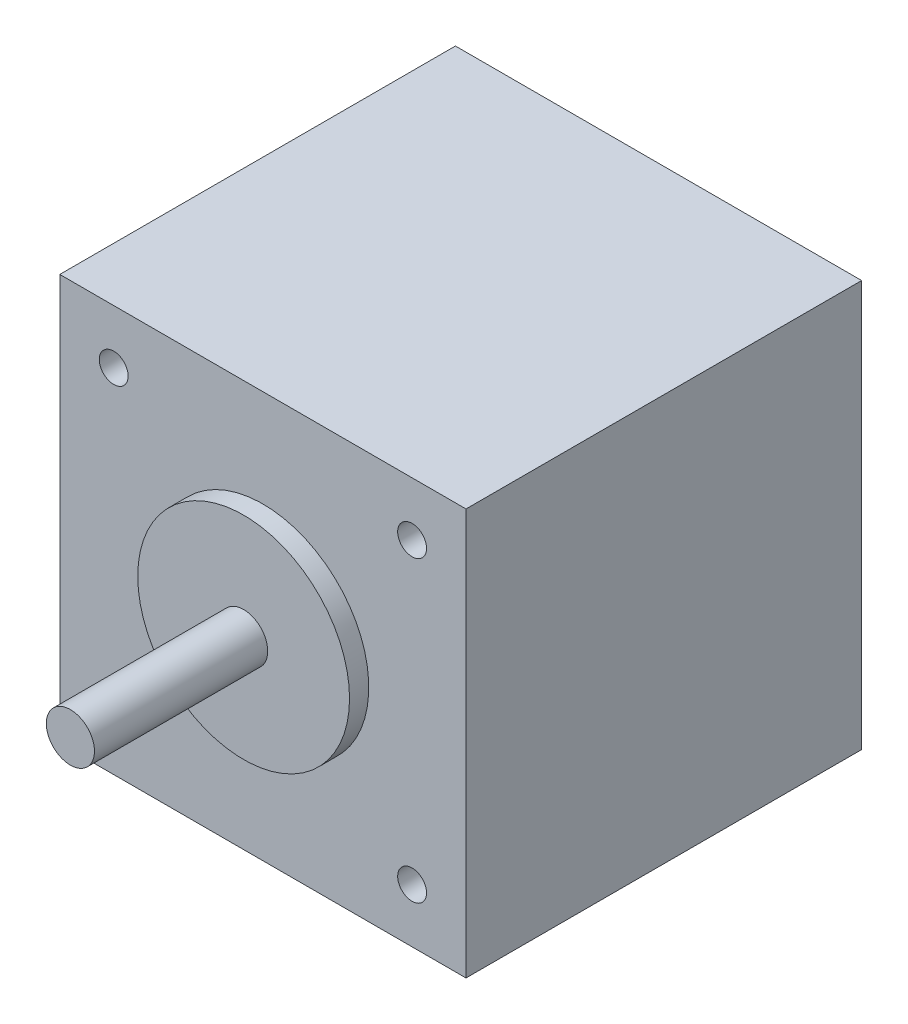
ISO-10303-21;
HEADER;
FILE_DESCRIPTION(('STEP AP214'),'2;1');
FILE_NAME('part.step','',(''),(''),'','','');
FILE_SCHEMA(('AUTOMOTIVE_DESIGN { 1 0 10303 214 1 1 1 1 }'));
ENDSEC;
DATA;
#1=APPLICATION_CONTEXT('core data for automotive mechanical design processes');
#2=APPLICATION_PROTOCOL_DEFINITION('international standard','automotive_design',2000,#1);
#3=PRODUCT_CONTEXT('',#1,'mechanical');
#4=PRODUCT('Part','Part','',(#3));
#5=PRODUCT_RELATED_PRODUCT_CATEGORY('part','',(#4));
#6=PRODUCT_DEFINITION_FORMATION('','',#4);
#7=PRODUCT_DEFINITION_CONTEXT('part definition',#1,'design');
#8=PRODUCT_DEFINITION('design','',#6,#7);
#9=PRODUCT_DEFINITION_SHAPE('','',#8);
#10=(LENGTH_UNIT() NAMED_UNIT(*) SI_UNIT(.MILLI.,.METRE.));
#11=(NAMED_UNIT(*) PLANE_ANGLE_UNIT() SI_UNIT($,.RADIAN.));
#12=(NAMED_UNIT(*) SI_UNIT($,.STERADIAN.) SOLID_ANGLE_UNIT());
#13=UNCERTAINTY_MEASURE_WITH_UNIT(LENGTH_MEASURE(1.E-05),#10,'distance_accuracy_value','');
#14=(GEOMETRIC_REPRESENTATION_CONTEXT(3) GLOBAL_UNCERTAINTY_ASSIGNED_CONTEXT((#13)) GLOBAL_UNIT_ASSIGNED_CONTEXT((#10,
#11,#12)) REPRESENTATION_CONTEXT('',''));
#15=CARTESIAN_POINT('',(0.,0.,0.));
#16=DIRECTION('',(0.,0.,1.));
#17=DIRECTION('',(1.,0.,0.));
#18=AXIS2_PLACEMENT_3D('',#15,#16,#17);
#19=CARTESIAN_POINT('',(7.02359479370018,4.42273020296525,43.1));
#20=DIRECTION('',(0.,0.,1.));
#21=DIRECTION('',(1.,0.,0.));
#22=AXIS2_PLACEMENT_3D('',#19,#20,#21);
#23=PLANE('',#22);
#24=CARTESIAN_POINT('',(7.02359479370018,4.42273020296525,43.1));
#25=DIRECTION('',(0.,0.,1.));
#26=DIRECTION('',(1.,0.,0.));
#27=AXIS2_PLACEMENT_3D('',#24,#25,#26);
#28=CIRCLE('',#27,11.);
#29=CARTESIAN_POINT('',(18.0235947937002,4.42273020296525,43.1));
#30=VERTEX_POINT('',#29);
#31=EDGE_CURVE('E101',#30,#30,#28,.T.);
#32=ORIENTED_EDGE('',*,*,#31,.T.);
#33=EDGE_LOOP('',(#32));
#34=FACE_BOUND('',#33,.T.);
#35=CARTESIAN_POINT('',(7.02359479370018,4.42273020296525,43.1));
#36=DIRECTION('',(0.,0.,1.));
#37=DIRECTION('',(1.,0.,0.));
#38=AXIS2_PLACEMENT_3D('',#35,#36,#37);
#39=CIRCLE('',#38,2.5);
#40=CARTESIAN_POINT('',(9.52359479370018,4.42273020296525,43.1));
#41=VERTEX_POINT('',#40);
#42=EDGE_CURVE('E197',#41,#41,#39,.T.);
#43=ORIENTED_EDGE('',*,*,#42,.F.);
#44=EDGE_LOOP('',(#43));
#45=FACE_BOUND('',#44,.T.);
#46=ADVANCED_FACE('F30',(#34,#45),#23,.T.);
#47=CARTESIAN_POINT('',(28.1235947937002,-16.6772697970347,41.1));
#48=DIRECTION('',(0.,0.,-1.));
#49=DIRECTION('',(-1.,0.,0.));
#50=AXIS2_PLACEMENT_3D('',#47,#48,#49);
#51=PLANE('',#50);
#52=CARTESIAN_POINT('',(-8.47640520629982,-11.0772697970348,41.1));
#53=DIRECTION('',(0.,0.,1.));
#54=DIRECTION('',(-1.,0.,0.));
#55=AXIS2_PLACEMENT_3D('',#52,#53,#54);
#56=CIRCLE('',#55,1.5);
#57=CARTESIAN_POINT('',(-9.97640520629982,-11.0772697970348,41.1));
#58=VERTEX_POINT('',#57);
#59=EDGE_CURVE('E177',#58,#58,#56,.T.);
#60=ORIENTED_EDGE('',*,*,#59,.F.);
#61=EDGE_LOOP('',(#60));
#62=FACE_BOUND('',#61,.T.);
#63=CARTESIAN_POINT('',(22.5235947937002,-11.0772697970347,41.1));
#64=DIRECTION('',(0.,0.,1.));
#65=DIRECTION('',(1.,0.,0.));
#66=AXIS2_PLACEMENT_3D('',#63,#64,#65);
#67=CIRCLE('',#66,1.5);
#68=CARTESIAN_POINT('',(24.0235947937002,-11.0772697970347,41.1));
#69=VERTEX_POINT('',#68);
#70=EDGE_CURVE('E176',#69,#69,#67,.T.);
#71=ORIENTED_EDGE('',*,*,#70,.F.);
#72=EDGE_LOOP('',(#71));
#73=FACE_BOUND('',#72,.T.);
#74=CARTESIAN_POINT('',(22.5235947937002,19.9227302029653,41.1));
#75=DIRECTION('',(0.,0.,1.));
#76=DIRECTION('',(-1.,0.,0.));
#77=AXIS2_PLACEMENT_3D('',#74,#75,#76);
#78=CIRCLE('',#77,1.5);
#79=CARTESIAN_POINT('',(21.0235947937002,19.9227302029653,41.1));
#80=VERTEX_POINT('',#79);
#81=EDGE_CURVE('E186',#80,#80,#78,.T.);
#82=ORIENTED_EDGE('',*,*,#81,.F.);
#83=EDGE_LOOP('',(#82));
#84=FACE_BOUND('',#83,.T.);
#85=CARTESIAN_POINT('',(-8.47640520629982,19.9227302029652,41.1));
#86=DIRECTION('',(0.,0.,1.));
#87=DIRECTION('',(1.,0.,0.));
#88=AXIS2_PLACEMENT_3D('',#85,#86,#87);
#89=CIRCLE('',#88,1.5);
#90=CARTESIAN_POINT('',(-6.97640520629982,19.9227302029652,41.1));
#91=VERTEX_POINT('',#90);
#92=EDGE_CURVE('E191',#91,#91,#89,.T.);
#93=ORIENTED_EDGE('',*,*,#92,.F.);
#94=EDGE_LOOP('',(#93));
#95=FACE_BOUND('',#94,.T.);
#96=DIRECTION('',(0.,1.,0.));
#97=VECTOR('',#96,1.);
#98=CARTESIAN_POINT('',(28.1235947937002,25.5227302029652,41.1));
#99=LINE('',#98,#97);
#100=CARTESIAN_POINT('',(28.1235947937002,-16.6772697970347,41.1));
#101=VERTEX_POINT('',#100);
#102=CARTESIAN_POINT('',(28.1235947937002,25.5227302029652,41.1));
#103=VERTEX_POINT('',#102);
#104=EDGE_CURVE('E84',#101,#103,#99,.T.);
#105=ORIENTED_EDGE('',*,*,#104,.T.);
#106=DIRECTION('',(-1.,0.,0.));
#107=VECTOR('',#106,1.);
#108=CARTESIAN_POINT('',(28.1235947937002,25.5227302029652,41.1));
#109=LINE('',#108,#107);
#110=CARTESIAN_POINT('',(-14.0764052062998,25.5227302029652,41.1));
#111=VERTEX_POINT('',#110);
#112=EDGE_CURVE('E78',#103,#111,#109,.T.);
#113=ORIENTED_EDGE('',*,*,#112,.T.);
#114=DIRECTION('',(0.,-1.,0.));
#115=VECTOR('',#114,1.);
#116=CARTESIAN_POINT('',(-14.0764052062998,25.5227302029652,41.1));
#117=LINE('',#116,#115);
#118=CARTESIAN_POINT('',(-14.0764052062998,-16.6772697970348,41.1));
#119=VERTEX_POINT('',#118);
#120=EDGE_CURVE('E82',#111,#119,#117,.T.);
#121=ORIENTED_EDGE('',*,*,#120,.T.);
#122=DIRECTION('',(1.,0.,0.));
#123=VECTOR('',#122,1.);
#124=CARTESIAN_POINT('',(28.1235947937002,-16.6772697970347,41.1));
#125=LINE('',#124,#123);
#126=EDGE_CURVE('E47',#119,#101,#125,.T.);
#127=ORIENTED_EDGE('',*,*,#126,.T.);
#128=EDGE_LOOP('',(#105,#113,#121,#127));
#129=FACE_BOUND('',#128,.T.);
#130=CARTESIAN_POINT('',(7.02359479370018,4.42273020296525,41.1));
#131=DIRECTION('',(0.,0.,-1.));
#132=DIRECTION('',(-1.,0.,0.));
#133=AXIS2_PLACEMENT_3D('',#130,#131,#132);
#134=CIRCLE('',#133,11.);
#135=CARTESIAN_POINT('',(-3.97640520629982,4.42273020296525,41.1));
#136=VERTEX_POINT('',#135);
#137=EDGE_CURVE('E11',#136,#136,#134,.F.);
#138=ORIENTED_EDGE('',*,*,#137,.F.);
#139=EDGE_LOOP('',(#138));
#140=FACE_BOUND('',#139,.T.);
#141=ADVANCED_FACE('F79',(#62,#73,#84,#95,#129,#140),#51,.F.);
#142=CARTESIAN_POINT('',(28.1235947937002,25.5227302029652,41.1));
#143=DIRECTION('',(-1.,0.,0.));
#144=DIRECTION('',(0.,-1.,0.));
#145=AXIS2_PLACEMENT_3D('',#142,#143,#144);
#146=PLANE('',#145);
#147=DIRECTION('',(0.,1.,0.));
#148=VECTOR('',#147,1.);
#149=CARTESIAN_POINT('',(28.1235947937002,25.5227302029652,0.));
#150=LINE('',#149,#148);
#151=CARTESIAN_POINT('',(28.1235947937002,-16.6772697970347,0.));
#152=VERTEX_POINT('',#151);
#153=CARTESIAN_POINT('',(28.1235947937002,25.5227302029652,0.));
#154=VERTEX_POINT('',#153);
#155=EDGE_CURVE('E98',#152,#154,#150,.T.);
#156=ORIENTED_EDGE('',*,*,#155,.T.);
#157=DIRECTION('',(0.,0.,-1.));
#158=VECTOR('',#157,1.);
#159=CARTESIAN_POINT('',(28.1235947937002,25.5227302029652,41.1));
#160=LINE('',#159,#158);
#161=EDGE_CURVE('E39',#103,#154,#160,.T.);
#162=ORIENTED_EDGE('',*,*,#161,.F.);
#163=ORIENTED_EDGE('',*,*,#104,.F.);
#164=DIRECTION('',(0.,0.,-1.));
#165=VECTOR('',#164,1.);
#166=CARTESIAN_POINT('',(28.1235947937002,-16.6772697970347,41.1));
#167=LINE('',#166,#165);
#168=EDGE_CURVE('E94',#101,#152,#167,.T.);
#169=ORIENTED_EDGE('',*,*,#168,.T.);
#170=EDGE_LOOP('',(#156,#162,#163,#169));
#171=FACE_BOUND('',#170,.T.);
#172=ADVANCED_FACE('F32',(#171),#146,.F.);
#173=CARTESIAN_POINT('',(28.1235947937002,25.5227302029652,41.1));
#174=DIRECTION('',(0.,-1.,0.));
#175=DIRECTION('',(0.,0.,-1.));
#176=AXIS2_PLACEMENT_3D('',#173,#174,#175);
#177=PLANE('',#176);
#178=DIRECTION('',(-1.,0.,0.));
#179=VECTOR('',#178,1.);
#180=CARTESIAN_POINT('',(28.1235947937002,25.5227302029652,0.));
#181=LINE('',#180,#179);
#182=CARTESIAN_POINT('',(-14.0764052062998,25.5227302029652,0.));
#183=VERTEX_POINT('',#182);
#184=EDGE_CURVE('E89',#154,#183,#181,.T.);
#185=ORIENTED_EDGE('',*,*,#184,.T.);
#186=DIRECTION('',(0.,0.,-1.));
#187=VECTOR('',#186,1.);
#188=CARTESIAN_POINT('',(-14.0764052062998,25.5227302029652,41.1));
#189=LINE('',#188,#187);
#190=EDGE_CURVE('E87',#111,#183,#189,.T.);
#191=ORIENTED_EDGE('',*,*,#190,.F.);
#192=ORIENTED_EDGE('',*,*,#112,.F.);
#193=ORIENTED_EDGE('',*,*,#161,.T.);
#194=EDGE_LOOP('',(#185,#191,#192,#193));
#195=FACE_BOUND('',#194,.T.);
#196=ADVANCED_FACE('F88',(#195),#177,.F.);
#197=CARTESIAN_POINT('',(-14.0764052062998,25.5227302029652,41.1));
#198=DIRECTION('',(1.,0.,0.));
#199=DIRECTION('',(0.,1.,0.));
#200=AXIS2_PLACEMENT_3D('',#197,#198,#199);
#201=PLANE('',#200);
#202=DIRECTION('',(0.,-1.,0.));
#203=VECTOR('',#202,1.);
#204=CARTESIAN_POINT('',(-14.0764052062998,25.5227302029652,0.));
#205=LINE('',#204,#203);
#206=CARTESIAN_POINT('',(-14.0764052062998,-16.6772697970348,0.));
#207=VERTEX_POINT('',#206);
#208=EDGE_CURVE('E64',#183,#207,#205,.T.);
#209=ORIENTED_EDGE('',*,*,#208,.T.);
#210=DIRECTION('',(0.,0.,-1.));
#211=VECTOR('',#210,1.);
#212=CARTESIAN_POINT('',(-14.0764052062998,-16.6772697970348,41.1));
#213=LINE('',#212,#211);
#214=EDGE_CURVE('E90',#119,#207,#213,.T.);
#215=ORIENTED_EDGE('',*,*,#214,.F.);
#216=ORIENTED_EDGE('',*,*,#120,.F.);
#217=ORIENTED_EDGE('',*,*,#190,.T.);
#218=EDGE_LOOP('',(#209,#215,#216,#217));
#219=FACE_BOUND('',#218,.T.);
#220=ADVANCED_FACE('F92',(#219),#201,.F.);
#221=CARTESIAN_POINT('',(28.1235947937002,-16.6772697970347,41.1));
#222=DIRECTION('',(0.,1.,0.));
#223=DIRECTION('',(-1.,0.,0.));
#224=AXIS2_PLACEMENT_3D('',#221,#222,#223);
#225=PLANE('',#224);
#226=DIRECTION('',(1.,0.,0.));
#227=VECTOR('',#226,1.);
#228=CARTESIAN_POINT('',(28.1235947937002,-16.6772697970347,0.));
#229=LINE('',#228,#227);
#230=EDGE_CURVE('E70',#207,#152,#229,.T.);
#231=ORIENTED_EDGE('',*,*,#230,.T.);
#232=ORIENTED_EDGE('',*,*,#168,.F.);
#233=ORIENTED_EDGE('',*,*,#126,.F.);
#234=ORIENTED_EDGE('',*,*,#214,.T.);
#235=EDGE_LOOP('',(#231,#232,#233,#234));
#236=FACE_BOUND('',#235,.T.);
#237=ADVANCED_FACE('F112',(#236),#225,.F.);
#238=CARTESIAN_POINT('',(28.1235947937002,-16.6772697970347,0.));
#239=DIRECTION('',(0.,0.,-1.));
#240=DIRECTION('',(-1.,0.,0.));
#241=AXIS2_PLACEMENT_3D('',#238,#239,#240);
#242=PLANE('',#241);
#243=ORIENTED_EDGE('',*,*,#155,.F.);
#244=ORIENTED_EDGE('',*,*,#230,.F.);
#245=ORIENTED_EDGE('',*,*,#208,.F.);
#246=ORIENTED_EDGE('',*,*,#184,.F.);
#247=EDGE_LOOP('',(#243,#244,#245,#246));
#248=FACE_BOUND('',#247,.T.);
#249=ADVANCED_FACE('F109',(#248),#242,.T.);
#250=CARTESIAN_POINT('',(7.02359479370018,4.42273020296525,43.1));
#251=DIRECTION('',(0.,0.,-1.));
#252=DIRECTION('',(-1.,0.,0.));
#253=AXIS2_PLACEMENT_3D('',#250,#251,#252);
#254=CYLINDRICAL_SURFACE('',#253,11.);
#255=ORIENTED_EDGE('',*,*,#31,.F.);
#256=EDGE_LOOP('',(#255));
#257=FACE_BOUND('',#256,.T.);
#258=ORIENTED_EDGE('',*,*,#137,.T.);
#259=EDGE_LOOP('',(#258));
#260=FACE_BOUND('',#259,.T.);
#261=ADVANCED_FACE('F111',(#257,#260),#254,.T.);
#262=CARTESIAN_POINT('',(7.02359479370018,4.42273020296525,61.1));
#263=DIRECTION('',(0.,0.,-1.));
#264=DIRECTION('',(-1.,0.,0.));
#265=AXIS2_PLACEMENT_3D('',#262,#263,#264);
#266=CYLINDRICAL_SURFACE('',#265,2.5);
#267=CARTESIAN_POINT('',(7.02359479370018,4.42273020296525,61.1));
#268=DIRECTION('',(0.,0.,1.));
#269=DIRECTION('',(1.,0.,0.));
#270=AXIS2_PLACEMENT_3D('',#267,#268,#269);
#271=CIRCLE('',#270,2.5);
#272=CARTESIAN_POINT('',(9.52359479370018,4.42273020296525,61.1));
#273=VERTEX_POINT('',#272);
#274=EDGE_CURVE('E200',#273,#273,#271,.T.);
#275=ORIENTED_EDGE('',*,*,#274,.F.);
#276=EDGE_LOOP('',(#275));
#277=FACE_BOUND('',#276,.T.);
#278=ORIENTED_EDGE('',*,*,#42,.T.);
#279=EDGE_LOOP('',(#278));
#280=FACE_BOUND('',#279,.T.);
#281=ADVANCED_FACE('F118',(#277,#280),#266,.T.);
#282=CARTESIAN_POINT('',(7.02359479370018,4.42273020296525,61.1));
#283=DIRECTION('',(0.,0.,1.));
#284=DIRECTION('',(1.,0.,0.));
#285=AXIS2_PLACEMENT_3D('',#282,#283,#284);
#286=PLANE('',#285);
#287=ORIENTED_EDGE('',*,*,#274,.T.);
#288=EDGE_LOOP('',(#287));
#289=FACE_BOUND('',#288,.T.);
#290=ADVANCED_FACE('F135',(#289),#286,.T.);
#291=CARTESIAN_POINT('',(-8.47640520629982,19.9227302029652,37.1));
#292=DIRECTION('',(0.,0.,1.));
#293=DIRECTION('',(1.,0.,0.));
#294=AXIS2_PLACEMENT_3D('',#291,#292,#293);
#295=CYLINDRICAL_SURFACE('',#294,1.5);
#296=CARTESIAN_POINT('',(-8.47640520629982,19.9227302029652,37.1));
#297=DIRECTION('',(0.,0.,1.));
#298=DIRECTION('',(1.,0.,0.));
#299=AXIS2_PLACEMENT_3D('',#296,#297,#298);
#300=CIRCLE('',#299,1.5);
#301=CARTESIAN_POINT('',(-6.97640520629982,19.9227302029652,37.1));
#302=VERTEX_POINT('',#301);
#303=EDGE_CURVE('E194',#302,#302,#300,.T.);
#304=ORIENTED_EDGE('',*,*,#303,.F.);
#305=EDGE_LOOP('',(#304));
#306=FACE_BOUND('',#305,.T.);
#307=ORIENTED_EDGE('',*,*,#92,.T.);
#308=EDGE_LOOP('',(#307));
#309=FACE_BOUND('',#308,.T.);
#310=ADVANCED_FACE('F139',(#306,#309),#295,.F.);
#311=CARTESIAN_POINT('',(-8.47640520629982,19.9227302029652,37.1));
#312=DIRECTION('',(0.,0.,1.));
#313=DIRECTION('',(1.,0.,0.));
#314=AXIS2_PLACEMENT_3D('',#311,#312,#313);
#315=PLANE('',#314);
#316=ORIENTED_EDGE('',*,*,#303,.T.);
#317=EDGE_LOOP('',(#316));
#318=FACE_BOUND('',#317,.T.);
#319=ADVANCED_FACE('F143',(#318),#315,.T.);
#320=CARTESIAN_POINT('',(22.5235947937002,19.9227302029653,37.1));
#321=DIRECTION('',(0.,0.,1.));
#322=DIRECTION('',(1.,0.,0.));
#323=AXIS2_PLACEMENT_3D('',#320,#321,#322);
#324=CYLINDRICAL_SURFACE('',#323,1.5);
#325=CARTESIAN_POINT('',(22.5235947937002,19.9227302029653,37.1));
#326=DIRECTION('',(0.,0.,1.));
#327=DIRECTION('',(-1.,0.,0.));
#328=AXIS2_PLACEMENT_3D('',#325,#326,#327);
#329=CIRCLE('',#328,1.5);
#330=CARTESIAN_POINT('',(21.0235947937002,19.9227302029653,37.1));
#331=VERTEX_POINT('',#330);
#332=EDGE_CURVE('E188',#331,#331,#329,.T.);
#333=ORIENTED_EDGE('',*,*,#332,.F.);
#334=EDGE_LOOP('',(#333));
#335=FACE_BOUND('',#334,.T.);
#336=ORIENTED_EDGE('',*,*,#81,.T.);
#337=EDGE_LOOP('',(#336));
#338=FACE_BOUND('',#337,.T.);
#339=ADVANCED_FACE('F147',(#335,#338),#324,.F.);
#340=CARTESIAN_POINT('',(22.5235947937002,19.9227302029653,37.1));
#341=DIRECTION('',(0.,0.,-1.));
#342=DIRECTION('',(-1.,0.,0.));
#343=AXIS2_PLACEMENT_3D('',#340,#341,#342);
#344=PLANE('',#343);
#345=ORIENTED_EDGE('',*,*,#332,.T.);
#346=EDGE_LOOP('',(#345));
#347=FACE_BOUND('',#346,.T.);
#348=ADVANCED_FACE('F151',(#347),#344,.F.);
#349=CARTESIAN_POINT('',(22.5235947937002,-11.0772697970347,37.1));
#350=DIRECTION('',(0.,0.,1.));
#351=DIRECTION('',(1.,0.,0.));
#352=AXIS2_PLACEMENT_3D('',#349,#350,#351);
#353=CYLINDRICAL_SURFACE('',#352,1.5);
#354=CARTESIAN_POINT('',(22.5235947937002,-11.0772697970347,37.1));
#355=DIRECTION('',(0.,0.,1.));
#356=DIRECTION('',(1.,0.,0.));
#357=AXIS2_PLACEMENT_3D('',#354,#355,#356);
#358=CIRCLE('',#357,1.5);
#359=CARTESIAN_POINT('',(24.0235947937002,-11.0772697970347,37.1));
#360=VERTEX_POINT('',#359);
#361=EDGE_CURVE('E180',#360,#360,#358,.T.);
#362=ORIENTED_EDGE('',*,*,#361,.F.);
#363=EDGE_LOOP('',(#362));
#364=FACE_BOUND('',#363,.T.);
#365=ORIENTED_EDGE('',*,*,#70,.T.);
#366=EDGE_LOOP('',(#365));
#367=FACE_BOUND('',#366,.T.);
#368=ADVANCED_FACE('F155',(#364,#367),#353,.F.);
#369=CARTESIAN_POINT('',(22.5235947937002,-11.0772697970347,37.1));
#370=DIRECTION('',(0.,0.,1.));
#371=DIRECTION('',(1.,0.,0.));
#372=AXIS2_PLACEMENT_3D('',#369,#370,#371);
#373=PLANE('',#372);
#374=ORIENTED_EDGE('',*,*,#361,.T.);
#375=EDGE_LOOP('',(#374));
#376=FACE_BOUND('',#375,.T.);
#377=ADVANCED_FACE('F159',(#376),#373,.T.);
#378=CARTESIAN_POINT('',(-8.47640520629982,-11.0772697970348,37.1));
#379=DIRECTION('',(0.,0.,1.));
#380=DIRECTION('',(1.,0.,0.));
#381=AXIS2_PLACEMENT_3D('',#378,#379,#380);
#382=CYLINDRICAL_SURFACE('',#381,1.5);
#383=CARTESIAN_POINT('',(-8.47640520629982,-11.0772697970348,37.1));
#384=DIRECTION('',(0.,0.,1.));
#385=DIRECTION('',(-1.,0.,0.));
#386=AXIS2_PLACEMENT_3D('',#383,#384,#385);
#387=CIRCLE('',#386,1.5);
#388=CARTESIAN_POINT('',(-9.97640520629982,-11.0772697970348,37.1));
#389=VERTEX_POINT('',#388);
#390=EDGE_CURVE('E175',#389,#389,#387,.T.);
#391=ORIENTED_EDGE('',*,*,#390,.F.);
#392=EDGE_LOOP('',(#391));
#393=FACE_BOUND('',#392,.T.);
#394=ORIENTED_EDGE('',*,*,#59,.T.);
#395=EDGE_LOOP('',(#394));
#396=FACE_BOUND('',#395,.T.);
#397=ADVANCED_FACE('F163',(#393,#396),#382,.F.);
#398=CARTESIAN_POINT('',(-8.47640520629982,-11.0772697970348,37.1));
#399=DIRECTION('',(0.,0.,-1.));
#400=DIRECTION('',(-1.,0.,0.));
#401=AXIS2_PLACEMENT_3D('',#398,#399,#400);
#402=PLANE('',#401);
#403=ORIENTED_EDGE('',*,*,#390,.T.);
#404=EDGE_LOOP('',(#403));
#405=FACE_BOUND('',#404,.T.);
#406=ADVANCED_FACE('F167',(#405),#402,.F.);
#407=CLOSED_SHELL('',(#46,#141,#172,#196,#220,#237,#249,#261,#281,#290,#310,#319,#339,#348,#368,
#377,#397,#406));
#408=MANIFOLD_SOLID_BREP('B2',#407);
#409=ADVANCED_BREP_SHAPE_REPRESENTATION('',(#18,#408),#14);
#410=SHAPE_DEFINITION_REPRESENTATION(#9,#409);
ENDSEC;
END-ISO-10303-21;
